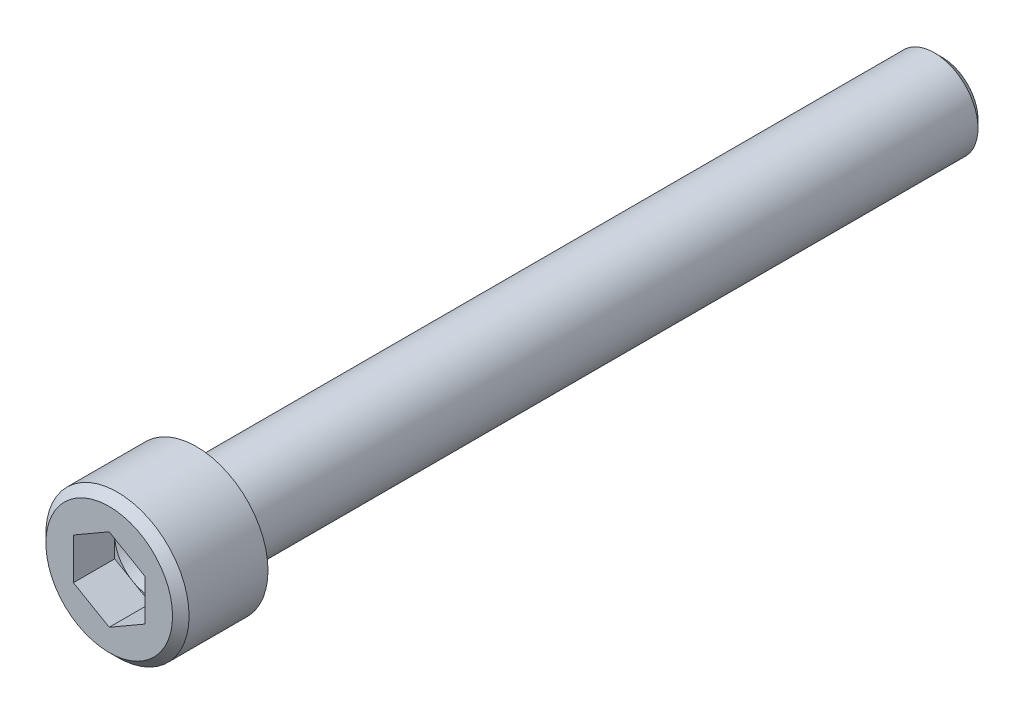
ISO-10303-21;
HEADER;
FILE_DESCRIPTION(('STEP AP214'),'2;1');
FILE_NAME('part.step','',(''),(''),'','','');
FILE_SCHEMA(('AUTOMOTIVE_DESIGN { 1 0 10303 214 1 1 1 1 }'));
ENDSEC;
DATA;
#1=APPLICATION_CONTEXT('core data for automotive mechanical design processes');
#2=APPLICATION_PROTOCOL_DEFINITION('international standard','automotive_design',2000,#1);
#3=PRODUCT_CONTEXT('',#1,'mechanical');
#4=PRODUCT('Part','Part','',(#3));
#5=PRODUCT_RELATED_PRODUCT_CATEGORY('part','',(#4));
#6=PRODUCT_DEFINITION_FORMATION('','',#4);
#7=PRODUCT_DEFINITION_CONTEXT('part definition',#1,'design');
#8=PRODUCT_DEFINITION('design','',#6,#7);
#9=PRODUCT_DEFINITION_SHAPE('','',#8);
#10=(LENGTH_UNIT() NAMED_UNIT(*) SI_UNIT(.MILLI.,.METRE.));
#11=(NAMED_UNIT(*) PLANE_ANGLE_UNIT() SI_UNIT($,.RADIAN.));
#12=(NAMED_UNIT(*) SI_UNIT($,.STERADIAN.) SOLID_ANGLE_UNIT());
#13=UNCERTAINTY_MEASURE_WITH_UNIT(LENGTH_MEASURE(1.E-05),#10,'distance_accuracy_value','');
#14=(GEOMETRIC_REPRESENTATION_CONTEXT(3) GLOBAL_UNCERTAINTY_ASSIGNED_CONTEXT((#13)) GLOBAL_UNIT_ASSIGNED_CONTEXT((#10,
#11,#12)) REPRESENTATION_CONTEXT('',''));
#15=CARTESIAN_POINT('',(0.,0.,0.));
#16=DIRECTION('',(0.,0.,1.));
#17=DIRECTION('',(1.,0.,0.));
#18=AXIS2_PLACEMENT_3D('',#15,#16,#17);
#19=CARTESIAN_POINT('',(0.,0.,2.54));
#20=DIRECTION('',(0.,0.,1.));
#21=DIRECTION('',(1.,0.,0.));
#22=AXIS2_PLACEMENT_3D('',#19,#20,#21);
#23=PLANE('',#22);
#24=DIRECTION('',(0.,1.,0.));
#25=VECTOR('',#24,1.);
#26=CARTESIAN_POINT('',(-1.9812,0.,2.54));
#27=LINE('',#26,#25);
#28=CARTESIAN_POINT('',(-1.9812,0.,2.54));
#29=VERTEX_POINT('',#28);
#30=CARTESIAN_POINT('',(-1.9812,1.14384635331848,2.54));
#31=VERTEX_POINT('',#30);
#32=EDGE_CURVE('E397',#29,#31,#27,.T.);
#33=ORIENTED_EDGE('',*,*,#32,.F.);
#34=CARTESIAN_POINT('',(0.,0.,2.54));
#35=DIRECTION('',(0.,0.,-1.));
#36=DIRECTION('',(-1.,0.,0.));
#37=AXIS2_PLACEMENT_3D('',#34,#35,#36);
#38=CIRCLE('',#37,1.9812);
#39=CARTESIAN_POINT('',(-0.9906,1.71576952997773,2.54));
#40=VERTEX_POINT('',#39);
#41=EDGE_CURVE('E33',#29,#40,#38,.T.);
#42=ORIENTED_EDGE('',*,*,#41,.T.);
#43=DIRECTION('',(0.866025403784439,0.5,0.));
#44=VECTOR('',#43,1.);
#45=CARTESIAN_POINT('',(0.163354175866616,2.38200528404682,2.54));
#46=LINE('',#45,#44);
#47=EDGE_CURVE('E392',#31,#40,#46,.T.);
#48=ORIENTED_EDGE('',*,*,#47,.F.);
#49=EDGE_LOOP('',(#33,#42,#48));
#50=FACE_BOUND('',#49,.T.);
#51=ADVANCED_FACE('F17',(#50),#23,.T.);
#52=CARTESIAN_POINT('',(0.,2.28769270663697,2.54));
#53=VERTEX_POINT('',#52);
#54=EDGE_CURVE('E390',#40,#53,#46,.T.);
#55=ORIENTED_EDGE('',*,*,#54,.F.);
#56=CARTESIAN_POINT('',(0.9906,1.71576952997773,2.54));
#57=VERTEX_POINT('',#56);
#58=EDGE_CURVE('E223',#40,#57,#38,.T.);
#59=ORIENTED_EDGE('',*,*,#58,.T.);
#60=DIRECTION('',(0.866025403784439,-0.5,0.));
#61=VECTOR('',#60,1.);
#62=CARTESIAN_POINT('',(-0.163354175866613,2.38200528404681,2.54));
#63=LINE('',#62,#61);
#64=EDGE_CURVE('E382',#53,#57,#63,.T.);
#65=ORIENTED_EDGE('',*,*,#64,.F.);
#66=EDGE_LOOP('',(#55,#59,#65));
#67=FACE_BOUND('',#66,.T.);
#68=ADVANCED_FACE('F105',(#67),#23,.T.);
#69=CARTESIAN_POINT('',(1.9812,1.14384635331849,2.54));
#70=VERTEX_POINT('',#69);
#71=EDGE_CURVE('E190',#57,#70,#63,.T.);
#72=ORIENTED_EDGE('',*,*,#71,.F.);
#73=CARTESIAN_POINT('',(1.9812,0.,2.54));
#74=VERTEX_POINT('',#73);
#75=EDGE_CURVE('E379',#57,#74,#38,.T.);
#76=ORIENTED_EDGE('',*,*,#75,.T.);
#77=DIRECTION('',(0.,-1.,0.));
#78=VECTOR('',#77,1.);
#79=CARTESIAN_POINT('',(1.9812,0.,2.54));
#80=LINE('',#79,#78);
#81=EDGE_CURVE('E160',#70,#74,#80,.T.);
#82=ORIENTED_EDGE('',*,*,#81,.F.);
#83=EDGE_LOOP('',(#72,#76,#82));
#84=FACE_BOUND('',#83,.T.);
#85=ADVANCED_FACE('F111',(#84),#23,.T.);
#86=CARTESIAN_POINT('',(1.9812,-1.14384635331849,2.54));
#87=VERTEX_POINT('',#86);
#88=EDGE_CURVE('E155',#74,#87,#80,.T.);
#89=ORIENTED_EDGE('',*,*,#88,.F.);
#90=CARTESIAN_POINT('',(0.9906,-1.71576952997773,2.54));
#91=VERTEX_POINT('',#90);
#92=EDGE_CURVE('E417',#74,#91,#38,.T.);
#93=ORIENTED_EDGE('',*,*,#92,.T.);
#94=DIRECTION('',(-0.866025403784438,-0.5,0.));
#95=VECTOR('',#94,1.);
#96=CARTESIAN_POINT('',(2.14455417586661,-1.04953377590865,2.54));
#97=LINE('',#96,#95);
#98=EDGE_CURVE('E148',#87,#91,#97,.T.);
#99=ORIENTED_EDGE('',*,*,#98,.F.);
#100=EDGE_LOOP('',(#89,#93,#99));
#101=FACE_BOUND('',#100,.T.);
#102=ADVANCED_FACE('F129',(#101),#23,.T.);
#103=CARTESIAN_POINT('',(0.,-2.28769270663697,2.54));
#104=VERTEX_POINT('',#103);
#105=EDGE_CURVE('E141',#91,#104,#97,.T.);
#106=ORIENTED_EDGE('',*,*,#105,.F.);
#107=CARTESIAN_POINT('',(-0.9906,-1.71576952997773,2.54));
#108=VERTEX_POINT('',#107);
#109=EDGE_CURVE('E143',#91,#108,#38,.T.);
#110=ORIENTED_EDGE('',*,*,#109,.T.);
#111=DIRECTION('',(-0.866025403784439,0.5,0.));
#112=VECTOR('',#111,1.);
#113=CARTESIAN_POINT('',(-2.14455417586661,-1.04953377590865,2.54));
#114=LINE('',#113,#112);
#115=EDGE_CURVE('E145',#104,#108,#114,.T.);
#116=ORIENTED_EDGE('',*,*,#115,.F.);
#117=EDGE_LOOP('',(#106,#110,#116));
#118=FACE_BOUND('',#117,.T.);
#119=ADVANCED_FACE('F119',(#118),#23,.T.);
#120=CARTESIAN_POINT('',(0.,0.,4.826));
#121=DIRECTION('',(0.,0.,1.));
#122=DIRECTION('',(1.,0.,0.));
#123=AXIS2_PLACEMENT_3D('',#120,#121,#122);
#124=PLANE('',#123);
#125=CARTESIAN_POINT('',(0.,0.,4.826));
#126=DIRECTION('',(0.,0.,1.));
#127=DIRECTION('',(1.,0.,0.));
#128=AXIS2_PLACEMENT_3D('',#125,#126,#127);
#129=CIRCLE('',#128,3.5052);
#130=CARTESIAN_POINT('',(3.5052,0.,4.826));
#131=VERTEX_POINT('',#130);
#132=EDGE_CURVE('E209',#131,#131,#129,.T.);
#133=ORIENTED_EDGE('',*,*,#132,.T.);
#134=EDGE_LOOP('',(#133));
#135=FACE_BOUND('',#134,.T.);
#136=DIRECTION('',(0.866025403784439,0.5,0.));
#137=VECTOR('',#136,1.);
#138=CARTESIAN_POINT('',(0.163354175866616,2.38200528404682,4.826));
#139=LINE('',#138,#137);
#140=CARTESIAN_POINT('',(-1.9812,1.14384635331848,4.826));
#141=VERTEX_POINT('',#140);
#142=CARTESIAN_POINT('',(0.,2.28769270663697,4.826));
#143=VERTEX_POINT('',#142);
#144=EDGE_CURVE('E172',#141,#143,#139,.T.);
#145=ORIENTED_EDGE('',*,*,#144,.T.);
#146=DIRECTION('',(0.866025403784439,-0.5,0.));
#147=VECTOR('',#146,1.);
#148=CARTESIAN_POINT('',(-0.163354175866613,2.38200528404681,4.826));
#149=LINE('',#148,#147);
#150=CARTESIAN_POINT('',(1.9812,1.14384635331849,4.826));
#151=VERTEX_POINT('',#150);
#152=EDGE_CURVE('E168',#143,#151,#149,.T.);
#153=ORIENTED_EDGE('',*,*,#152,.T.);
#154=DIRECTION('',(0.,-1.,0.));
#155=VECTOR('',#154,1.);
#156=CARTESIAN_POINT('',(1.9812,0.,4.826));
#157=LINE('',#156,#155);
#158=CARTESIAN_POINT('',(1.9812,-1.14384635331849,4.826));
#159=VERTEX_POINT('',#158);
#160=EDGE_CURVE('E186',#151,#159,#157,.T.);
#161=ORIENTED_EDGE('',*,*,#160,.T.);
#162=DIRECTION('',(-0.866025403784438,-0.5,0.));
#163=VECTOR('',#162,1.);
#164=CARTESIAN_POINT('',(2.14455417586661,-1.04953377590865,4.826));
#165=LINE('',#164,#163);
#166=CARTESIAN_POINT('',(0.,-2.28769270663697,4.826));
#167=VERTEX_POINT('',#166);
#168=EDGE_CURVE('E41',#159,#167,#165,.T.);
#169=ORIENTED_EDGE('',*,*,#168,.T.);
#170=DIRECTION('',(-0.866025403784439,0.5,0.));
#171=VECTOR('',#170,1.);
#172=CARTESIAN_POINT('',(-2.14455417586661,-1.04953377590865,4.826));
#173=LINE('',#172,#171);
#174=CARTESIAN_POINT('',(-1.9812,-1.14384635331849,4.826));
#175=VERTEX_POINT('',#174);
#176=EDGE_CURVE('E180',#167,#175,#173,.T.);
#177=ORIENTED_EDGE('',*,*,#176,.T.);
#178=DIRECTION('',(0.,1.,0.));
#179=VECTOR('',#178,1.);
#180=CARTESIAN_POINT('',(-1.9812,0.,4.826));
#181=LINE('',#180,#179);
#182=EDGE_CURVE('E176',#175,#141,#181,.T.);
#183=ORIENTED_EDGE('',*,*,#182,.T.);
#184=EDGE_LOOP('',(#145,#153,#161,#169,#177,#183));
#185=FACE_BOUND('',#184,.T.);
#186=ADVANCED_FACE('F128',(#135,#185),#124,.T.);
#187=CARTESIAN_POINT('',(0.,0.,4.826));
#188=DIRECTION('',(0.,0.,-1.));
#189=DIRECTION('',(-1.,0.,0.));
#190=AXIS2_PLACEMENT_3D('',#187,#188,#189);
#191=CYLINDRICAL_SURFACE('',#190,3.9624);
#192=CARTESIAN_POINT('',(0.,0.,4.3688));
#193=DIRECTION('',(0.,0.,1.));
#194=DIRECTION('',(1.,0.,0.));
#195=AXIS2_PLACEMENT_3D('',#192,#193,#194);
#196=CIRCLE('',#195,3.9624);
#197=CARTESIAN_POINT('',(3.9624,0.,4.3688));
#198=VERTEX_POINT('',#197);
#199=EDGE_CURVE('E213',#198,#198,#196,.F.);
#200=ORIENTED_EDGE('',*,*,#199,.T.);
#201=EDGE_LOOP('',(#200));
#202=FACE_BOUND('',#201,.T.);
#203=CARTESIAN_POINT('',(0.,0.,0.));
#204=DIRECTION('',(0.,0.,1.));
#205=DIRECTION('',(1.,0.,0.));
#206=AXIS2_PLACEMENT_3D('',#203,#204,#205);
#207=CIRCLE('',#206,3.9624);
#208=CARTESIAN_POINT('',(3.9624,0.,0.));
#209=VERTEX_POINT('',#208);
#210=EDGE_CURVE('E206',#209,#209,#207,.T.);
#211=ORIENTED_EDGE('',*,*,#210,.T.);
#212=EDGE_LOOP('',(#211));
#213=FACE_BOUND('',#212,.T.);
#214=ADVANCED_FACE('F134',(#202,#213),#191,.T.);
#215=CARTESIAN_POINT('',(0.,0.,0.));
#216=DIRECTION('',(0.,0.,1.));
#217=DIRECTION('',(1.,0.,0.));
#218=AXIS2_PLACEMENT_3D('',#215,#216,#217);
#219=PLANE('',#218);
#220=CARTESIAN_POINT('',(0.,0.,0.));
#221=DIRECTION('',(0.,0.,1.));
#222=DIRECTION('',(1.,0.,0.));
#223=AXIS2_PLACEMENT_3D('',#220,#221,#222);
#224=CIRCLE('',#223,2.5654);
#225=CARTESIAN_POINT('',(2.5654,0.,0.));
#226=VERTEX_POINT('',#225);
#227=EDGE_CURVE('E222',#226,#226,#224,.T.);
#228=ORIENTED_EDGE('',*,*,#227,.T.);
#229=EDGE_LOOP('',(#228));
#230=FACE_BOUND('',#229,.T.);
#231=ORIENTED_EDGE('',*,*,#210,.F.);
#232=EDGE_LOOP('',(#231));
#233=FACE_BOUND('',#232,.T.);
#234=ADVANCED_FACE('F323',(#230,#233),#219,.F.);
#235=CARTESIAN_POINT('',(0.,0.,4.826));
#236=DIRECTION('',(0.,0.,-1.));
#237=DIRECTION('',(-1.,0.,0.));
#238=AXIS2_PLACEMENT_3D('',#235,#236,#237);
#239=CONICAL_SURFACE('',#238,3.5052,0.785398163397449);
#240=ORIENTED_EDGE('',*,*,#199,.F.);
#241=EDGE_LOOP('',(#240));
#242=FACE_BOUND('',#241,.T.);
#243=ORIENTED_EDGE('',*,*,#132,.F.);
#244=EDGE_LOOP('',(#243));
#245=FACE_BOUND('',#244,.T.);
#246=ADVANCED_FACE('F314',(#242,#245),#239,.T.);
#247=CARTESIAN_POINT('',(-0.163354175866613,2.38200528404681,2.54));
#248=DIRECTION('',(-0.5,-0.866025403784439,0.));
#249=DIRECTION('',(0.866025403784439,-0.5,0.));
#250=AXIS2_PLACEMENT_3D('',#247,#248,#249);
#251=PLANE('',#250);
#252=ORIENTED_EDGE('',*,*,#152,.F.);
#253=DIRECTION('',(0.,0.,1.));
#254=VECTOR('',#253,1.);
#255=CARTESIAN_POINT('',(0.,2.28769270663697,2.54));
#256=LINE('',#255,#254);
#257=EDGE_CURVE('E203',#53,#143,#256,.T.);
#258=ORIENTED_EDGE('',*,*,#257,.F.);
#259=ORIENTED_EDGE('',*,*,#64,.T.);
#260=ORIENTED_EDGE('',*,*,#71,.T.);
#261=DIRECTION('',(0.,0.,1.));
#262=VECTOR('',#261,1.);
#263=CARTESIAN_POINT('',(1.9812,1.14384635331849,2.54));
#264=LINE('',#263,#262);
#265=EDGE_CURVE('E167',#70,#151,#264,.T.);
#266=ORIENTED_EDGE('',*,*,#265,.T.);
#267=EDGE_LOOP('',(#252,#258,#259,#260,#266));
#268=FACE_BOUND('',#267,.T.);
#269=ADVANCED_FACE('F305',(#268),#251,.T.);
#270=CARTESIAN_POINT('',(0.163354175866616,2.38200528404682,2.54));
#271=DIRECTION('',(0.5,-0.866025403784438,0.));
#272=DIRECTION('',(0.866025403784438,0.5,0.));
#273=AXIS2_PLACEMENT_3D('',#270,#271,#272);
#274=PLANE('',#273);
#275=ORIENTED_EDGE('',*,*,#144,.F.);
#276=DIRECTION('',(0.,0.,1.));
#277=VECTOR('',#276,1.);
#278=CARTESIAN_POINT('',(-1.9812,1.14384635331848,2.54));
#279=LINE('',#278,#277);
#280=EDGE_CURVE('E200',#31,#141,#279,.T.);
#281=ORIENTED_EDGE('',*,*,#280,.F.);
#282=ORIENTED_EDGE('',*,*,#47,.T.);
#283=ORIENTED_EDGE('',*,*,#54,.T.);
#284=ORIENTED_EDGE('',*,*,#257,.T.);
#285=EDGE_LOOP('',(#275,#281,#282,#283,#284));
#286=FACE_BOUND('',#285,.T.);
#287=ADVANCED_FACE('F296',(#286),#274,.T.);
#288=CARTESIAN_POINT('',(-1.9812,0.,2.54));
#289=DIRECTION('',(1.,0.,0.));
#290=DIRECTION('',(0.,1.,0.));
#291=AXIS2_PLACEMENT_3D('',#288,#289,#290);
#292=PLANE('',#291);
#293=ORIENTED_EDGE('',*,*,#182,.F.);
#294=DIRECTION('',(0.,0.,1.));
#295=VECTOR('',#294,1.);
#296=CARTESIAN_POINT('',(-1.9812,-1.14384635331849,2.54));
#297=LINE('',#296,#295);
#298=CARTESIAN_POINT('',(-1.9812,-1.14384635331849,2.54));
#299=VERTEX_POINT('',#298);
#300=EDGE_CURVE('E197',#299,#175,#297,.T.);
#301=ORIENTED_EDGE('',*,*,#300,.F.);
#302=EDGE_CURVE('E398',#299,#29,#27,.T.);
#303=ORIENTED_EDGE('',*,*,#302,.T.);
#304=ORIENTED_EDGE('',*,*,#32,.T.);
#305=ORIENTED_EDGE('',*,*,#280,.T.);
#306=EDGE_LOOP('',(#293,#301,#303,#304,#305));
#307=FACE_BOUND('',#306,.T.);
#308=ADVANCED_FACE('F287',(#307),#292,.T.);
#309=CARTESIAN_POINT('',(-2.14455417586661,-1.04953377590865,2.54));
#310=DIRECTION('',(0.5,0.866025403784439,0.));
#311=DIRECTION('',(-0.866025403784439,0.5,0.));
#312=AXIS2_PLACEMENT_3D('',#309,#310,#311);
#313=PLANE('',#312);
#314=ORIENTED_EDGE('',*,*,#176,.F.);
#315=DIRECTION('',(0.,0.,1.));
#316=VECTOR('',#315,1.);
#317=CARTESIAN_POINT('',(0.,-2.28769270663697,2.54));
#318=LINE('',#317,#316);
#319=EDGE_CURVE('E194',#104,#167,#318,.T.);
#320=ORIENTED_EDGE('',*,*,#319,.F.);
#321=ORIENTED_EDGE('',*,*,#115,.T.);
#322=EDGE_CURVE('E401',#108,#299,#114,.T.);
#323=ORIENTED_EDGE('',*,*,#322,.T.);
#324=ORIENTED_EDGE('',*,*,#300,.T.);
#325=EDGE_LOOP('',(#314,#320,#321,#323,#324));
#326=FACE_BOUND('',#325,.T.);
#327=ADVANCED_FACE('F279',(#326),#313,.T.);
#328=CARTESIAN_POINT('',(2.14455417586661,-1.04953377590865,2.54));
#329=DIRECTION('',(-0.5,0.866025403784438,0.));
#330=DIRECTION('',(-0.866025403784438,-0.5,0.));
#331=AXIS2_PLACEMENT_3D('',#328,#329,#330);
#332=PLANE('',#331);
#333=ORIENTED_EDGE('',*,*,#168,.F.);
#334=DIRECTION('',(0.,0.,1.));
#335=VECTOR('',#334,1.);
#336=CARTESIAN_POINT('',(1.9812,-1.14384635331849,2.54));
#337=LINE('',#336,#335);
#338=EDGE_CURVE('E151',#87,#159,#337,.T.);
#339=ORIENTED_EDGE('',*,*,#338,.F.);
#340=ORIENTED_EDGE('',*,*,#98,.T.);
#341=ORIENTED_EDGE('',*,*,#105,.T.);
#342=ORIENTED_EDGE('',*,*,#319,.T.);
#343=EDGE_LOOP('',(#333,#339,#340,#341,#342));
#344=FACE_BOUND('',#343,.T.);
#345=ADVANCED_FACE('F124',(#344),#332,.T.);
#346=CARTESIAN_POINT('',(1.9812,0.,2.54));
#347=DIRECTION('',(-1.,0.,0.));
#348=DIRECTION('',(0.,-1.,0.));
#349=AXIS2_PLACEMENT_3D('',#346,#347,#348);
#350=PLANE('',#349);
#351=ORIENTED_EDGE('',*,*,#160,.F.);
#352=ORIENTED_EDGE('',*,*,#265,.F.);
#353=ORIENTED_EDGE('',*,*,#81,.T.);
#354=ORIENTED_EDGE('',*,*,#88,.T.);
#355=ORIENTED_EDGE('',*,*,#338,.T.);
#356=EDGE_LOOP('',(#351,#352,#353,#354,#355));
#357=FACE_BOUND('',#356,.T.);
#358=ADVANCED_FACE('F117',(#357),#350,.T.);
#359=ORIENTED_EDGE('',*,*,#322,.F.);
#360=EDGE_CURVE('E217',#108,#29,#38,.T.);
#361=ORIENTED_EDGE('',*,*,#360,.T.);
#362=ORIENTED_EDGE('',*,*,#302,.F.);
#363=EDGE_LOOP('',(#359,#361,#362));
#364=FACE_BOUND('',#363,.T.);
#365=ADVANCED_FACE('F108',(#364),#23,.T.);
#366=CARTESIAN_POINT('',(0.,0.,-41.275));
#367=DIRECTION('',(0.,0.,1.));
#368=DIRECTION('',(1.,0.,0.));
#369=AXIS2_PLACEMENT_3D('',#366,#367,#368);
#370=CYLINDRICAL_SURFACE('',#369,2.413);
#371=CARTESIAN_POINT('',(0.,0.,-40.84605761938));
#372=DIRECTION('',(0.,0.,-1.));
#373=DIRECTION('',(-1.,0.,0.));
#374=AXIS2_PLACEMENT_3D('',#371,#372,#373);
#375=CIRCLE('',#374,2.413);
#376=CARTESIAN_POINT('',(-2.413,0.,-40.84605761938));
#377=VERTEX_POINT('',#376);
#378=EDGE_CURVE('E11',#377,#377,#375,.F.);
#379=ORIENTED_EDGE('',*,*,#378,.T.);
#380=EDGE_LOOP('',(#379));
#381=FACE_BOUND('',#380,.T.);
#382=CARTESIAN_POINT('',(0.,0.,-0.152399999999997));
#383=DIRECTION('',(0.,0.,1.));
#384=DIRECTION('',(1.,0.,0.));
#385=AXIS2_PLACEMENT_3D('',#382,#383,#384);
#386=CIRCLE('',#385,2.413);
#387=CARTESIAN_POINT('',(2.413,0.,-0.152399999999997));
#388=VERTEX_POINT('',#387);
#389=EDGE_CURVE('E218',#388,#388,#386,.F.);
#390=ORIENTED_EDGE('',*,*,#389,.T.);
#391=EDGE_LOOP('',(#390));
#392=FACE_BOUND('',#391,.T.);
#393=ADVANCED_FACE('F101',(#381,#392),#370,.T.);
#394=CARTESIAN_POINT('',(0.,0.,-41.275));
#395=DIRECTION('',(0.,0.,-1.));
#396=DIRECTION('',(1.,0.,0.));
#397=AXIS2_PLACEMENT_3D('',#394,#395,#396);
#398=PLANE('',#397);
#399=CARTESIAN_POINT('',(0.,0.,-41.275));
#400=DIRECTION('',(0.,0.,-1.));
#401=DIRECTION('',(-1.,0.,0.));
#402=AXIS2_PLACEMENT_3D('',#399,#400,#401);
#403=CIRCLE('',#402,1.98405761938);
#404=CARTESIAN_POINT('',(-1.98405761938,0.,-41.275));
#405=VERTEX_POINT('',#404);
#406=EDGE_CURVE('E26',#405,#405,#403,.T.);
#407=ORIENTED_EDGE('',*,*,#406,.T.);
#408=EDGE_LOOP('',(#407));
#409=FACE_BOUND('',#408,.T.);
#410=ADVANCED_FACE('F94',(#409),#398,.T.);
#411=CARTESIAN_POINT('',(0.,0.,1.39615364668151));
#412=DIRECTION('',(0.,0.,1.));
#413=DIRECTION('',(1.,0.,0.));
#414=AXIS2_PLACEMENT_3D('',#411,#412,#413);
#415=CONICAL_SURFACE('',#414,0.,1.0471975511966);
#416=ORIENTED_EDGE('',*,*,#41,.F.);
#417=ORIENTED_EDGE('',*,*,#360,.F.);
#418=ORIENTED_EDGE('',*,*,#109,.F.);
#419=ORIENTED_EDGE('',*,*,#92,.F.);
#420=ORIENTED_EDGE('',*,*,#75,.F.);
#421=ORIENTED_EDGE('',*,*,#58,.F.);
#422=EDGE_LOOP('',(#416,#417,#418,#419,#420,#421));
#423=FACE_BOUND('',#422,.T.);
#424=CARTESIAN_POINT('',(0.,0.,1.39615364668151));
#425=VERTEX_POINT('',#424);
#426=VERTEX_LOOP('',#425);
#427=FACE_BOUND('',#426,.T.);
#428=ADVANCED_FACE('F91',(#423,#427),#415,.F.);
#429=CARTESIAN_POINT('',(0.,0.,-0.152399999999997));
#430=DIRECTION('',(0.,0.,1.));
#431=DIRECTION('',(1.,0.,0.));
#432=AXIS2_PLACEMENT_3D('',#429,#430,#431);
#433=TOROIDAL_SURFACE('',#432,2.5654,0.1524);
#434=ORIENTED_EDGE('',*,*,#227,.F.);
#435=EDGE_LOOP('',(#434));
#436=FACE_BOUND('',#435,.T.);
#437=ORIENTED_EDGE('',*,*,#389,.F.);
#438=EDGE_LOOP('',(#437));
#439=FACE_BOUND('',#438,.T.);
#440=ADVANCED_FACE('F93',(#436,#439),#433,.F.);
#441=CARTESIAN_POINT('',(0.,0.,-41.275));
#442=DIRECTION('',(0.,0.,1.));
#443=DIRECTION('',(1.,0.,0.));
#444=AXIS2_PLACEMENT_3D('',#441,#442,#443);
#445=CONICAL_SURFACE('',#444,1.98405761938,0.785398163397445);
#446=ORIENTED_EDGE('',*,*,#378,.F.);
#447=EDGE_LOOP('',(#446));
#448=FACE_BOUND('',#447,.T.);
#449=ORIENTED_EDGE('',*,*,#406,.F.);
#450=EDGE_LOOP('',(#449));
#451=FACE_BOUND('',#450,.T.);
#452=ADVANCED_FACE('F19',(#448,#451),#445,.T.);
#453=CLOSED_SHELL('',(#51,#68,#85,#102,#119,#186,#214,#234,#246,#269,#287,#308,#327,#345,#358,
#365,#393,#410,#428,#440,#452));
#454=MANIFOLD_SOLID_BREP('B1',#453);
#455=ADVANCED_BREP_SHAPE_REPRESENTATION('',(#18,#454),#14);
#456=SHAPE_DEFINITION_REPRESENTATION(#9,#455);
ENDSEC;
END-ISO-10303-21;
